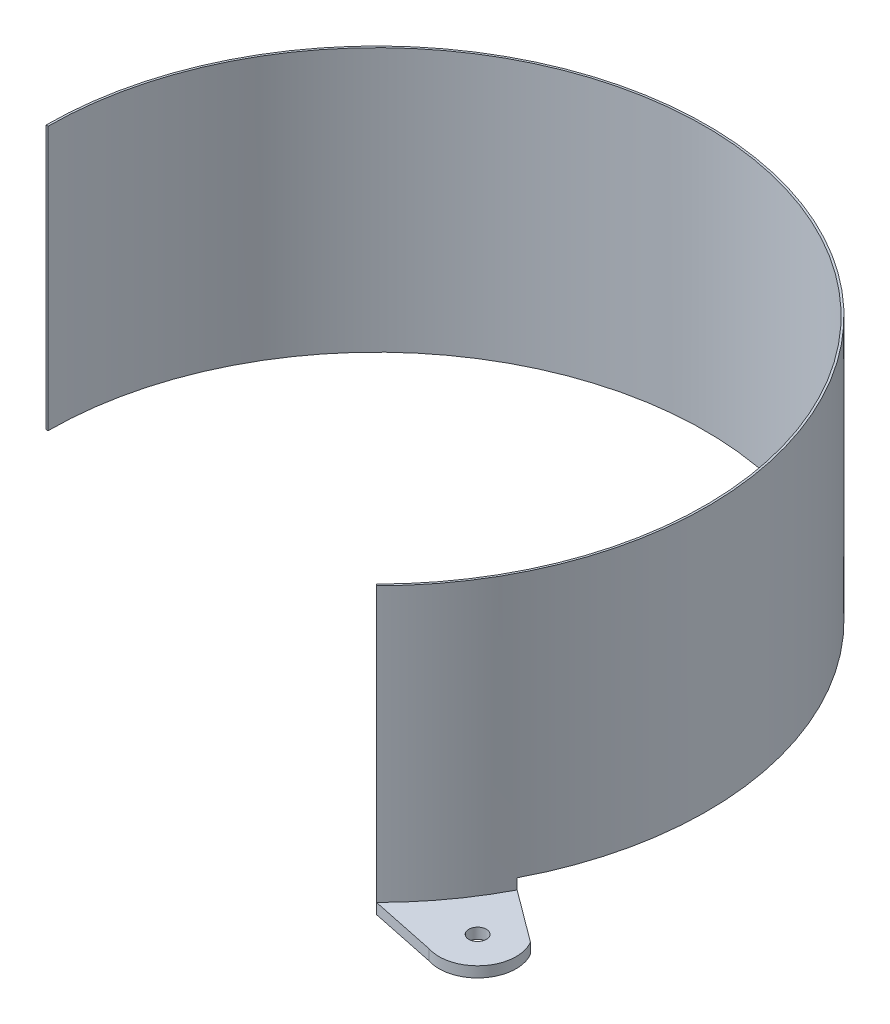
ISO-10303-21;
HEADER;
FILE_DESCRIPTION(('STEP AP214'),'2;1');
FILE_NAME('part.step','',(''),(''),'','','');
FILE_SCHEMA(('AUTOMOTIVE_DESIGN { 1 0 10303 214 1 1 1 1 }'));
ENDSEC;
DATA;
#1=APPLICATION_CONTEXT('core data for automotive mechanical design processes');
#2=APPLICATION_PROTOCOL_DEFINITION('international standard','automotive_design',2000,#1);
#3=PRODUCT_CONTEXT('',#1,'mechanical');
#4=PRODUCT('Part','Part','',(#3));
#5=PRODUCT_RELATED_PRODUCT_CATEGORY('part','',(#4));
#6=PRODUCT_DEFINITION_FORMATION('','',#4);
#7=PRODUCT_DEFINITION_CONTEXT('part definition',#1,'design');
#8=PRODUCT_DEFINITION('design','',#6,#7);
#9=PRODUCT_DEFINITION_SHAPE('','',#8);
#10=(LENGTH_UNIT() NAMED_UNIT(*) SI_UNIT(.MILLI.,.METRE.));
#11=(NAMED_UNIT(*) PLANE_ANGLE_UNIT() SI_UNIT($,.RADIAN.));
#12=(NAMED_UNIT(*) SI_UNIT($,.STERADIAN.) SOLID_ANGLE_UNIT());
#13=UNCERTAINTY_MEASURE_WITH_UNIT(LENGTH_MEASURE(1.E-05),#10,'distance_accuracy_value','');
#14=(GEOMETRIC_REPRESENTATION_CONTEXT(3) GLOBAL_UNCERTAINTY_ASSIGNED_CONTEXT((#13)) GLOBAL_UNIT_ASSIGNED_CONTEXT((#10,
#11,#12)) REPRESENTATION_CONTEXT('',''));
#15=CARTESIAN_POINT('',(0.,0.,0.));
#16=DIRECTION('',(0.,0.,1.));
#17=DIRECTION('',(1.,0.,0.));
#18=AXIS2_PLACEMENT_3D('',#15,#16,#17);
#19=CARTESIAN_POINT('',(0.,102.87,0.));
#20=DIRECTION('',(0.,-1.,0.));
#21=DIRECTION('',(0.,0.,-1.));
#22=AXIS2_PLACEMENT_3D('',#19,#20,#21);
#23=CYLINDRICAL_SURFACE('',#22,118.6434);
#24=CARTESIAN_POINT('',(0.,7.62,0.));
#25=DIRECTION('',(0.,-1.,0.));
#26=DIRECTION('',(0.,0.,-1.));
#27=AXIS2_PLACEMENT_3D('',#24,#25,#26);
#28=CIRCLE('',#27,118.6434);
#29=CARTESIAN_POINT('',(-118.6434,7.62,0.));
#30=VERTEX_POINT('',#29);
#31=CARTESIAN_POINT('',(105.237981085097,7.62,54.7834254194888));
#32=VERTEX_POINT('',#31);
#33=EDGE_CURVE('E85',#30,#32,#28,.T.);
#34=ORIENTED_EDGE('',*,*,#33,.T.);
#35=DIRECTION('',(0.,-1.,0.));
#36=VECTOR('',#35,1.);
#37=CARTESIAN_POINT('',(105.237981085097,7.62,54.7834254194888));
#38=LINE('',#37,#36);
#39=CARTESIAN_POINT('',(105.237981085097,0.,54.7834254194889));
#40=VERTEX_POINT('',#39);
#41=EDGE_CURVE('E143',#32,#40,#38,.T.);
#42=ORIENTED_EDGE('',*,*,#41,.T.);
#43=CARTESIAN_POINT('',(0.,0.,0.));
#44=DIRECTION('',(0.,1.,0.));
#45=DIRECTION('',(1.,0.,0.));
#46=AXIS2_PLACEMENT_3D('',#43,#44,#45);
#47=CIRCLE('',#46,118.6434);
#48=CARTESIAN_POINT('',(83.8935526830285,0.,83.8935526830275));
#49=VERTEX_POINT('',#48);
#50=EDGE_CURVE('E75',#40,#49,#47,.F.);
#51=ORIENTED_EDGE('',*,*,#50,.T.);
#52=DIRECTION('',(0.,-1.,0.));
#53=VECTOR('',#52,1.);
#54=CARTESIAN_POINT('',(83.8935526830285,102.87,83.8935526830275));
#55=LINE('',#54,#53);
#56=CARTESIAN_POINT('',(83.8935526830285,102.87,83.8935526830275));
#57=VERTEX_POINT('',#56);
#58=EDGE_CURVE('E11',#57,#49,#55,.T.);
#59=ORIENTED_EDGE('',*,*,#58,.F.);
#60=CARTESIAN_POINT('',(0.,102.87,0.));
#61=DIRECTION('',(0.,1.,0.));
#62=DIRECTION('',(1.,0.,0.));
#63=AXIS2_PLACEMENT_3D('',#60,#61,#62);
#64=CIRCLE('',#63,118.6434);
#65=CARTESIAN_POINT('',(-118.6434,102.87,0.));
#66=VERTEX_POINT('',#65);
#67=EDGE_CURVE('E112',#66,#57,#64,.F.);
#68=ORIENTED_EDGE('',*,*,#67,.F.);
#69=DIRECTION('',(0.,-1.,0.));
#70=VECTOR('',#69,1.);
#71=CARTESIAN_POINT('',(-118.6434,102.87,0.));
#72=LINE('',#71,#70);
#73=EDGE_CURVE('E61',#66,#30,#72,.T.);
#74=ORIENTED_EDGE('',*,*,#73,.T.);
#75=EDGE_LOOP('',(#34,#42,#51,#59,#68,#74));
#76=FACE_BOUND('',#75,.T.);
#77=ADVANCED_FACE('F38',(#76),#23,.F.);
#78=CARTESIAN_POINT('',(0.,102.87,0.));
#79=DIRECTION('',(0.,-1.,0.));
#80=DIRECTION('',(0.,0.,-1.));
#81=AXIS2_PLACEMENT_3D('',#78,#79,#80);
#82=CYLINDRICAL_SURFACE('',#81,119.38);
#83=CARTESIAN_POINT('',(-1.18238752122579E-11,3.81,-5.76622083414691E-12));
#84=DIRECTION('',(0.,1.,0.));
#85=DIRECTION('',(0.,0.,1.));
#86=AXIS2_PLACEMENT_3D('',#83,#84,#85);
#87=CIRCLE('',#86,119.380000000013);
#88=CARTESIAN_POINT('',(84.4144075380506,3.81,84.4144075380495));
#89=VERTEX_POINT('',#88);
#90=CARTESIAN_POINT('',(105.891353264816,3.81,55.1235494479977));
#91=VERTEX_POINT('',#90);
#92=EDGE_CURVE('E159',#89,#91,#87,.T.);
#93=ORIENTED_EDGE('',*,*,#92,.T.);
#94=DIRECTION('',(0.,-1.,0.));
#95=VECTOR('',#94,1.);
#96=CARTESIAN_POINT('',(105.891353264816,102.87,55.1235494479977));
#97=LINE('',#96,#95);
#98=CARTESIAN_POINT('',(105.891353264816,7.62,55.1235494479977));
#99=VERTEX_POINT('',#98);
#100=EDGE_CURVE('E140',#99,#91,#97,.T.);
#101=ORIENTED_EDGE('',*,*,#100,.F.);
#102=CARTESIAN_POINT('',(0.,7.62,0.));
#103=DIRECTION('',(0.,-1.,0.));
#104=DIRECTION('',(0.,0.,-1.));
#105=AXIS2_PLACEMENT_3D('',#102,#103,#104);
#106=CIRCLE('',#105,119.38);
#107=CARTESIAN_POINT('',(-119.38,7.62,0.));
#108=VERTEX_POINT('',#107);
#109=EDGE_CURVE('E133',#108,#99,#106,.T.);
#110=ORIENTED_EDGE('',*,*,#109,.F.);
#111=DIRECTION('',(0.,-1.,0.));
#112=VECTOR('',#111,1.);
#113=CARTESIAN_POINT('',(-119.38,102.87,0.));
#114=LINE('',#113,#112);
#115=CARTESIAN_POINT('',(-119.38,102.87,0.));
#116=VERTEX_POINT('',#115);
#117=EDGE_CURVE('E106',#116,#108,#114,.T.);
#118=ORIENTED_EDGE('',*,*,#117,.F.);
#119=CARTESIAN_POINT('',(0.,102.87,0.));
#120=DIRECTION('',(0.,-1.,0.));
#121=DIRECTION('',(0.,0.,-1.));
#122=AXIS2_PLACEMENT_3D('',#119,#120,#121);
#123=CIRCLE('',#122,119.38);
#124=CARTESIAN_POINT('',(84.4144075380506,102.87,84.4144075380495));
#125=VERTEX_POINT('',#124);
#126=EDGE_CURVE('E111',#116,#125,#123,.T.);
#127=ORIENTED_EDGE('',*,*,#126,.T.);
#128=DIRECTION('',(0.,-1.,0.));
#129=VECTOR('',#128,1.);
#130=CARTESIAN_POINT('',(84.4144075380506,102.87,84.4144075380495));
#131=LINE('',#130,#129);
#132=EDGE_CURVE('E45',#125,#89,#131,.T.);
#133=ORIENTED_EDGE('',*,*,#132,.T.);
#134=EDGE_LOOP('',(#93,#101,#110,#118,#127,#133));
#135=FACE_BOUND('',#134,.T.);
#136=ADVANCED_FACE('F114',(#135),#82,.T.);
#137=CARTESIAN_POINT('',(-118.6434,102.87,0.));
#138=DIRECTION('',(0.,0.,1.));
#139=DIRECTION('',(1.,0.,0.));
#140=AXIS2_PLACEMENT_3D('',#137,#138,#139);
#141=PLANE('',#140);
#142=ORIENTED_EDGE('',*,*,#117,.T.);
#143=DIRECTION('',(-1.,0.,0.));
#144=VECTOR('',#143,1.);
#145=CARTESIAN_POINT('',(-119.38,7.62,0.));
#146=LINE('',#145,#144);
#147=EDGE_CURVE('E124',#108,#30,#146,.F.);
#148=ORIENTED_EDGE('',*,*,#147,.T.);
#149=ORIENTED_EDGE('',*,*,#73,.F.);
#150=DIRECTION('',(-1.,0.,0.));
#151=VECTOR('',#150,1.);
#152=CARTESIAN_POINT('',(-118.6434,102.87,0.));
#153=LINE('',#152,#151);
#154=EDGE_CURVE('E117',#66,#116,#153,.T.);
#155=ORIENTED_EDGE('',*,*,#154,.T.);
#156=EDGE_LOOP('',(#142,#148,#149,#155));
#157=FACE_BOUND('',#156,.T.);
#158=ADVANCED_FACE('F128',(#157),#141,.T.);
#159=CARTESIAN_POINT('',(0.,0.,0.));
#160=DIRECTION('',(0.,1.,0.));
#161=DIRECTION('',(1.,0.,0.));
#162=AXIS2_PLACEMENT_3D('',#159,#160,#161);
#163=PLANE('',#162);
#164=DIRECTION('',(-0.887010833178224,0.,-0.461748613235029));
#165=VECTOR('',#164,1.);
#166=CARTESIAN_POINT('',(105.237981085097,0.,54.7834254194889));
#167=LINE('',#166,#165);
#168=CARTESIAN_POINT('',(105.891353264816,0.,55.1235494479977));
#169=VERTEX_POINT('',#168);
#170=EDGE_CURVE('E135',#40,#169,#167,.F.);
#171=ORIENTED_EDGE('',*,*,#170,.T.);
#172=DIRECTION('',(0.802613900828692,0.,0.596498890356512));
#173=VECTOR('',#172,1.);
#174=CARTESIAN_POINT('',(105.891353264816,0.,55.1235494479977));
#175=LINE('',#174,#173);
#176=CARTESIAN_POINT('',(124.635571408816,0.,69.0541645444372));
#177=VERTEX_POINT('',#176);
#178=EDGE_CURVE('E52',#169,#177,#175,.T.);
#179=ORIENTED_EDGE('',*,*,#178,.T.);
#180=CARTESIAN_POINT('',(112.618181959298,0.,76.1253321118033));
#181=DIRECTION('',(0.,-1.,0.));
#182=DIRECTION('',(0.,0.,1.));
#183=AXIS2_PLACEMENT_3D('',#180,#181,#182);
#184=CIRCLE('',#183,13.9434235375381);
#185=CARTESIAN_POINT('',(108.336377107683,0.,89.3950422503051));
#186=VERTEX_POINT('',#185);
#187=EDGE_CURVE('E160',#177,#186,#184,.T.);
#188=ORIENTED_EDGE('',*,*,#187,.T.);
#189=DIRECTION('',(-0.979005816522121,0.,-0.203832311510845));
#190=VECTOR('',#189,1.);
#191=CARTESIAN_POINT('',(84.4144075380506,0.,84.4144075380495));
#192=LINE('',#191,#190);
#193=CARTESIAN_POINT('',(84.4144075380506,0.,84.4144075380495));
#194=VERTEX_POINT('',#193);
#195=EDGE_CURVE('E156',#186,#194,#192,.T.);
#196=ORIENTED_EDGE('',*,*,#195,.T.);
#197=DIRECTION('',(-0.707106781186585,0.,-0.70710678118651));
#198=VECTOR('',#197,1.);
#199=CARTESIAN_POINT('',(84.4144075380506,0.,84.4144075380495));
#200=LINE('',#199,#198);
#201=EDGE_CURVE('E123',#194,#49,#200,.T.);
#202=ORIENTED_EDGE('',*,*,#201,.T.);
#203=ORIENTED_EDGE('',*,*,#50,.F.);
#204=EDGE_LOOP('',(#171,#179,#188,#196,#202,#203));
#205=FACE_BOUND('',#204,.T.);
#206=CARTESIAN_POINT('',(112.618181959298,0.,76.1253321118033));
#207=DIRECTION('',(0.,-1.,0.));
#208=DIRECTION('',(0.,0.,-1.));
#209=AXIS2_PLACEMENT_3D('',#206,#207,#208);
#210=CIRCLE('',#209,3.175);
#211=CARTESIAN_POINT('',(112.618181959298,0.,72.9503321118033));
#212=VERTEX_POINT('',#211);
#213=EDGE_CURVE('E174',#212,#212,#210,.T.);
#214=ORIENTED_EDGE('',*,*,#213,.F.);
#215=EDGE_LOOP('',(#214));
#216=FACE_BOUND('',#215,.T.);
#217=ADVANCED_FACE('F189',(#205,#216),#163,.F.);
#218=CARTESIAN_POINT('',(84.4144075380506,102.87,84.4144075380495));
#219=DIRECTION('',(-0.70710678118651,0.,0.707106781186585));
#220=DIRECTION('',(0.707106781186585,0.,0.70710678118651));
#221=AXIS2_PLACEMENT_3D('',#218,#219,#220);
#222=PLANE('',#221);
#223=ORIENTED_EDGE('',*,*,#201,.F.);
#224=DIRECTION('',(0.,-1.,0.));
#225=VECTOR('',#224,1.);
#226=CARTESIAN_POINT('',(84.4144075380506,3.81,84.4144075380495));
#227=LINE('',#226,#225);
#228=EDGE_CURVE('E102',#89,#194,#227,.T.);
#229=ORIENTED_EDGE('',*,*,#228,.F.);
#230=ORIENTED_EDGE('',*,*,#132,.F.);
#231=DIRECTION('',(-0.707106781186585,0.,-0.70710678118651));
#232=VECTOR('',#231,1.);
#233=CARTESIAN_POINT('',(84.4144075380506,102.87,84.4144075380495));
#234=LINE('',#233,#232);
#235=EDGE_CURVE('E99',#125,#57,#234,.T.);
#236=ORIENTED_EDGE('',*,*,#235,.T.);
#237=ORIENTED_EDGE('',*,*,#58,.T.);
#238=EDGE_LOOP('',(#223,#229,#230,#236,#237));
#239=FACE_BOUND('',#238,.T.);
#240=ADVANCED_FACE('F98',(#239),#222,.T.);
#241=CARTESIAN_POINT('',(0.,102.87,0.));
#242=DIRECTION('',(0.,1.,0.));
#243=DIRECTION('',(1.,0.,0.));
#244=AXIS2_PLACEMENT_3D('',#241,#242,#243);
#245=PLANE('',#244);
#246=ORIENTED_EDGE('',*,*,#67,.T.);
#247=ORIENTED_EDGE('',*,*,#235,.F.);
#248=ORIENTED_EDGE('',*,*,#126,.F.);
#249=ORIENTED_EDGE('',*,*,#154,.F.);
#250=EDGE_LOOP('',(#246,#247,#248,#249));
#251=FACE_BOUND('',#250,.T.);
#252=ADVANCED_FACE('F109',(#251),#245,.T.);
#253=CARTESIAN_POINT('',(0.,7.62,0.));
#254=DIRECTION('',(0.,1.,0.));
#255=DIRECTION('',(0.,0.,1.));
#256=AXIS2_PLACEMENT_3D('',#253,#254,#255);
#257=PLANE('',#256);
#258=ORIENTED_EDGE('',*,*,#147,.F.);
#259=ORIENTED_EDGE('',*,*,#109,.T.);
#260=DIRECTION('',(-0.887010833178224,0.,-0.461748613235028));
#261=VECTOR('',#260,1.);
#262=CARTESIAN_POINT('',(105.237981085097,7.62,54.7834254194888));
#263=LINE('',#262,#261);
#264=EDGE_CURVE('E137',#32,#99,#263,.F.);
#265=ORIENTED_EDGE('',*,*,#264,.F.);
#266=ORIENTED_EDGE('',*,*,#33,.F.);
#267=EDGE_LOOP('',(#258,#259,#265,#266));
#268=FACE_BOUND('',#267,.T.);
#269=ADVANCED_FACE('F219',(#268),#257,.F.);
#270=CARTESIAN_POINT('',(105.237981085097,3.81,54.7834254194888));
#271=DIRECTION('',(-0.461748613235029,0.,0.887010833178225));
#272=DIRECTION('',(0.,-1.,0.));
#273=AXIS2_PLACEMENT_3D('',#270,#271,#272);
#274=PLANE('',#273);
#275=ORIENTED_EDGE('',*,*,#170,.F.);
#276=ORIENTED_EDGE('',*,*,#41,.F.);
#277=ORIENTED_EDGE('',*,*,#264,.T.);
#278=ORIENTED_EDGE('',*,*,#100,.T.);
#279=DIRECTION('',(0.,-1.,0.));
#280=VECTOR('',#279,1.);
#281=CARTESIAN_POINT('',(105.891353264816,3.81,55.1235494479977));
#282=LINE('',#281,#280);
#283=EDGE_CURVE('E147',#91,#169,#282,.T.);
#284=ORIENTED_EDGE('',*,*,#283,.T.);
#285=EDGE_LOOP('',(#275,#276,#277,#278,#284));
#286=FACE_BOUND('',#285,.T.);
#287=ADVANCED_FACE('F223',(#286),#274,.F.);
#288=CARTESIAN_POINT('',(84.4144075380506,3.81,84.4144075380495));
#289=DIRECTION('',(-0.203832311510845,0.,0.979005816522121));
#290=DIRECTION('',(0.979005816522121,0.,0.203832311510845));
#291=AXIS2_PLACEMENT_3D('',#288,#289,#290);
#292=PLANE('',#291);
#293=ORIENTED_EDGE('',*,*,#195,.F.);
#294=DIRECTION('',(0.,-1.,0.));
#295=VECTOR('',#294,1.);
#296=CARTESIAN_POINT('',(108.336377107683,3.81,89.3950422503051));
#297=LINE('',#296,#295);
#298=CARTESIAN_POINT('',(108.336377107683,3.81,89.3950422503051));
#299=VERTEX_POINT('',#298);
#300=EDGE_CURVE('E152',#299,#186,#297,.T.);
#301=ORIENTED_EDGE('',*,*,#300,.F.);
#302=DIRECTION('',(-0.979005816522121,0.,-0.203832311510845));
#303=VECTOR('',#302,1.);
#304=CARTESIAN_POINT('',(84.4144075380506,3.81,84.4144075380495));
#305=LINE('',#304,#303);
#306=EDGE_CURVE('E150',#299,#89,#305,.T.);
#307=ORIENTED_EDGE('',*,*,#306,.T.);
#308=ORIENTED_EDGE('',*,*,#228,.T.);
#309=EDGE_LOOP('',(#293,#301,#307,#308));
#310=FACE_BOUND('',#309,.T.);
#311=ADVANCED_FACE('F236',(#310),#292,.T.);
#312=CARTESIAN_POINT('',(112.618181959298,3.81,76.1253321118033));
#313=DIRECTION('',(0.,-1.,0.));
#314=DIRECTION('',(0.,0.,-1.));
#315=AXIS2_PLACEMENT_3D('',#312,#313,#314);
#316=CYLINDRICAL_SURFACE('',#315,13.9434235375381);
#317=ORIENTED_EDGE('',*,*,#187,.F.);
#318=DIRECTION('',(0.,-1.,0.));
#319=VECTOR('',#318,1.);
#320=CARTESIAN_POINT('',(124.635571408816,3.81,69.0541645444372));
#321=LINE('',#320,#319);
#322=CARTESIAN_POINT('',(124.635571408816,3.81,69.0541645444372));
#323=VERTEX_POINT('',#322);
#324=EDGE_CURVE('E149',#323,#177,#321,.T.);
#325=ORIENTED_EDGE('',*,*,#324,.F.);
#326=CARTESIAN_POINT('',(112.618181959298,3.81,76.1253321118033));
#327=DIRECTION('',(0.,-1.,0.));
#328=DIRECTION('',(0.,0.,1.));
#329=AXIS2_PLACEMENT_3D('',#326,#327,#328);
#330=CIRCLE('',#329,13.9434235375381);
#331=EDGE_CURVE('E167',#323,#299,#330,.T.);
#332=ORIENTED_EDGE('',*,*,#331,.T.);
#333=ORIENTED_EDGE('',*,*,#300,.T.);
#334=EDGE_LOOP('',(#317,#325,#332,#333));
#335=FACE_BOUND('',#334,.T.);
#336=ADVANCED_FACE('F245',(#335),#316,.T.);
#337=CARTESIAN_POINT('',(105.891353264816,3.81,55.1235494479977));
#338=DIRECTION('',(0.596498890356512,0.,-0.802613900828692));
#339=DIRECTION('',(-0.802613900828692,0.,-0.596498890356512));
#340=AXIS2_PLACEMENT_3D('',#337,#338,#339);
#341=PLANE('',#340);
#342=ORIENTED_EDGE('',*,*,#178,.F.);
#343=ORIENTED_EDGE('',*,*,#283,.F.);
#344=DIRECTION('',(0.802613900828692,0.,0.596498890356512));
#345=VECTOR('',#344,1.);
#346=CARTESIAN_POINT('',(105.891353264816,3.81,55.1235494479977));
#347=LINE('',#346,#345);
#348=EDGE_CURVE('E170',#91,#323,#347,.T.);
#349=ORIENTED_EDGE('',*,*,#348,.T.);
#350=ORIENTED_EDGE('',*,*,#324,.T.);
#351=EDGE_LOOP('',(#342,#343,#349,#350));
#352=FACE_BOUND('',#351,.T.);
#353=ADVANCED_FACE('F253',(#352),#341,.T.);
#354=CARTESIAN_POINT('',(-1.18238752122579E-11,3.81,-5.76622083414691E-12));
#355=DIRECTION('',(0.,1.,0.));
#356=DIRECTION('',(0.,0.,1.));
#357=AXIS2_PLACEMENT_3D('',#354,#355,#356);
#358=PLANE('',#357);
#359=CARTESIAN_POINT('',(112.618181959298,3.81,76.1253321118033));
#360=DIRECTION('',(0.,-1.,0.));
#361=DIRECTION('',(0.,0.,-1.));
#362=AXIS2_PLACEMENT_3D('',#359,#360,#361);
#363=CIRCLE('',#362,3.175);
#364=CARTESIAN_POINT('',(112.618181959298,3.81,72.9503321118033));
#365=VERTEX_POINT('',#364);
#366=EDGE_CURVE('E164',#365,#365,#363,.T.);
#367=ORIENTED_EDGE('',*,*,#366,.T.);
#368=EDGE_LOOP('',(#367));
#369=FACE_BOUND('',#368,.T.);
#370=ORIENTED_EDGE('',*,*,#92,.F.);
#371=ORIENTED_EDGE('',*,*,#306,.F.);
#372=ORIENTED_EDGE('',*,*,#331,.F.);
#373=ORIENTED_EDGE('',*,*,#348,.F.);
#374=EDGE_LOOP('',(#370,#371,#372,#373));
#375=FACE_BOUND('',#374,.T.);
#376=ADVANCED_FACE('F180',(#369,#375),#358,.T.);
#377=CARTESIAN_POINT('',(112.618181959298,3.81,76.1253321118033));
#378=DIRECTION('',(0.,-1.,0.));
#379=DIRECTION('',(0.,0.,-1.));
#380=AXIS2_PLACEMENT_3D('',#377,#378,#379);
#381=CYLINDRICAL_SURFACE('',#380,3.175);
#382=CARTESIAN_POINT('',(112.618181959298,3.81,72.9503321118033));
#383=CARTESIAN_POINT('',(112.618181959298,3.7703125,72.9503321118033));
#384=CARTESIAN_POINT('',(112.618181959298,3.730625,72.9503321118033));
#385=CARTESIAN_POINT('',(112.618181959298,3.65125,72.9503321118033));
#386=CARTESIAN_POINT('',(112.618181959298,3.6115625,72.9503321118033));
#387=CARTESIAN_POINT('',(112.618181959298,3.5321875,72.9503321118033));
#388=CARTESIAN_POINT('',(112.618181959298,3.4925,72.9503321118033));
#389=CARTESIAN_POINT('',(112.618181959298,3.413125,72.9503321118033));
#390=CARTESIAN_POINT('',(112.618181959298,3.3734375,72.9503321118033));
#391=CARTESIAN_POINT('',(112.618181959298,3.2940625,72.9503321118033));
#392=CARTESIAN_POINT('',(112.618181959298,3.254375,72.9503321118033));
#393=CARTESIAN_POINT('',(112.618181959298,3.175,72.9503321118033));
#394=CARTESIAN_POINT('',(112.618181959298,3.1353125,72.9503321118033));
#395=CARTESIAN_POINT('',(112.618181959298,3.0559375,72.9503321118033));
#396=CARTESIAN_POINT('',(112.618181959298,3.01625,72.9503321118033));
#397=CARTESIAN_POINT('',(112.618181959298,2.936875,72.9503321118033));
#398=CARTESIAN_POINT('',(112.618181959298,2.8971875,72.9503321118033));
#399=CARTESIAN_POINT('',(112.618181959298,2.8178125,72.9503321118033));
#400=CARTESIAN_POINT('',(112.618181959298,2.778125,72.9503321118033));
#401=CARTESIAN_POINT('',(112.618181959298,2.69875,72.9503321118033));
#402=CARTESIAN_POINT('',(112.618181959298,2.6590625,72.9503321118033));
#403=CARTESIAN_POINT('',(112.618181959298,2.5796875,72.9503321118033));
#404=CARTESIAN_POINT('',(112.618181959298,2.54,72.9503321118033));
#405=CARTESIAN_POINT('',(112.618181959298,2.460625,72.9503321118033));
#406=CARTESIAN_POINT('',(112.618181959298,2.4209375,72.9503321118033));
#407=CARTESIAN_POINT('',(112.618181959298,2.3415625,72.9503321118033));
#408=CARTESIAN_POINT('',(112.618181959298,2.301875,72.9503321118033));
#409=CARTESIAN_POINT('',(112.618181959298,2.2225,72.9503321118033));
#410=CARTESIAN_POINT('',(112.618181959298,2.1828125,72.9503321118033));
#411=CARTESIAN_POINT('',(112.618181959298,2.1034375,72.9503321118033));
#412=CARTESIAN_POINT('',(112.618181959298,2.06375,72.9503321118033));
#413=CARTESIAN_POINT('',(112.618181959298,1.984375,72.9503321118033));
#414=CARTESIAN_POINT('',(112.618181959298,1.9446875,72.9503321118033));
#415=CARTESIAN_POINT('',(112.618181959298,1.8653125,72.9503321118033));
#416=CARTESIAN_POINT('',(112.618181959298,1.825625,72.9503321118033));
#417=CARTESIAN_POINT('',(112.618181959298,1.74625,72.9503321118033));
#418=CARTESIAN_POINT('',(112.618181959298,1.7065625,72.9503321118033));
#419=CARTESIAN_POINT('',(112.618181959298,1.6271875,72.9503321118033));
#420=CARTESIAN_POINT('',(112.618181959298,1.5875,72.9503321118033));
#421=CARTESIAN_POINT('',(112.618181959298,1.508125,72.9503321118033));
#422=CARTESIAN_POINT('',(112.618181959298,1.4684375,72.9503321118033));
#423=CARTESIAN_POINT('',(112.618181959298,1.3890625,72.9503321118033));
#424=CARTESIAN_POINT('',(112.618181959298,1.349375,72.9503321118033));
#425=CARTESIAN_POINT('',(112.618181959298,1.27,72.9503321118033));
#426=CARTESIAN_POINT('',(112.618181959298,1.2303125,72.9503321118033));
#427=CARTESIAN_POINT('',(112.618181959298,1.1509375,72.9503321118033));
#428=CARTESIAN_POINT('',(112.618181959298,1.11125,72.9503321118033));
#429=CARTESIAN_POINT('',(112.618181959298,1.031875,72.9503321118033));
#430=CARTESIAN_POINT('',(112.618181959298,0.9921875,72.9503321118033));
#431=CARTESIAN_POINT('',(112.618181959298,0.9128125,72.9503321118033));
#432=CARTESIAN_POINT('',(112.618181959298,0.873125,72.9503321118033));
#433=CARTESIAN_POINT('',(112.618181959298,0.79375,72.9503321118033));
#434=CARTESIAN_POINT('',(112.618181959298,0.7540625,72.9503321118033));
#435=CARTESIAN_POINT('',(112.618181959298,0.6746875,72.9503321118033));
#436=CARTESIAN_POINT('',(112.618181959298,0.635,72.9503321118033));
#437=CARTESIAN_POINT('',(112.618181959298,0.555625,72.9503321118033));
#438=CARTESIAN_POINT('',(112.618181959298,0.5159375,72.9503321118033));
#439=CARTESIAN_POINT('',(112.618181959298,0.4365625,72.9503321118033));
#440=CARTESIAN_POINT('',(112.618181959298,0.396875,72.9503321118033));
#441=CARTESIAN_POINT('',(112.618181959298,0.3175,72.9503321118033));
#442=CARTESIAN_POINT('',(112.618181959298,0.2778125,72.9503321118033));
#443=CARTESIAN_POINT('',(112.618181959298,0.1984375,72.9503321118033));
#444=CARTESIAN_POINT('',(112.618181959298,0.15875,72.9503321118033));
#445=CARTESIAN_POINT('',(112.618181959298,0.0793749999999999,72.9503321118033));
#446=CARTESIAN_POINT('',(112.618181959298,0.0396874999999999,72.9503321118033));
#447=CARTESIAN_POINT('',(112.618181959298,0.,72.9503321118033));
#448=B_SPLINE_CURVE_WITH_KNOTS('',3,(#382,#383,#384,#385,#386,#387,#388,#389,#390,#391,#392,
#393,#394,#395,#396,#397,#398,#399,#400,#401,#402,#403,#404,#405,#406,#407,#408,#409,#410,#411,
#412,#413,#414,#415,#416,#417,#418,#419,#420,#421,#422,#423,#424,#425,#426,#427,#428,#429,#430,
#431,#432,#433,#434,#435,#436,#437,#438,#439,#440,#441,#442,#443,#444,#445,#446,#447),
.UNSPECIFIED.,.F.,.F.,(4,2,2,2,2,2,2,2,2,2,2,2,2,2,2,2,2,2,2,2,2,2,2,2,2,2,2,2,2,2,2,2,4),(0.,
0.1190625,0.238125,0.3571875,0.47625,0.5953125,0.714375,0.833437499999999,0.9525,1.0715625,
1.190625,1.3096875,1.42875,1.5478125,1.666875,1.7859375,1.905,2.0240625,2.143125,2.2621875,
2.38125,2.5003125,2.619375,2.7384375,2.8575,2.9765625,3.095625,3.2146875,3.33375,3.4528125,
3.571875,3.6909375,3.81),.UNSPECIFIED.);
#449=EDGE_CURVE('BSEAM183',#365,#212,#448,.T.);
#450=ORIENTED_EDGE('',*,*,#366,.F.);
#451=ORIENTED_EDGE('',*,*,#213,.T.);
#452=ORIENTED_EDGE('',*,*,#449,.T.);
#453=ORIENTED_EDGE('',*,*,#449,.F.);
#454=EDGE_LOOP('',(#450,#452,#451,#453));
#455=FACE_BOUND('',#454,.T.);
#456=ADVANCED_FACE('F183',(#455),#381,.F.);
#457=CLOSED_SHELL('',(#77,#136,#158,#217,#240,#252,#269,#287,#311,#336,#353,#376,#456));
#458=MANIFOLD_SOLID_BREP('B2',#457);
#459=ADVANCED_BREP_SHAPE_REPRESENTATION('',(#18,#458),#14);
#460=SHAPE_DEFINITION_REPRESENTATION(#9,#459);
ENDSEC;
END-ISO-10303-21;
